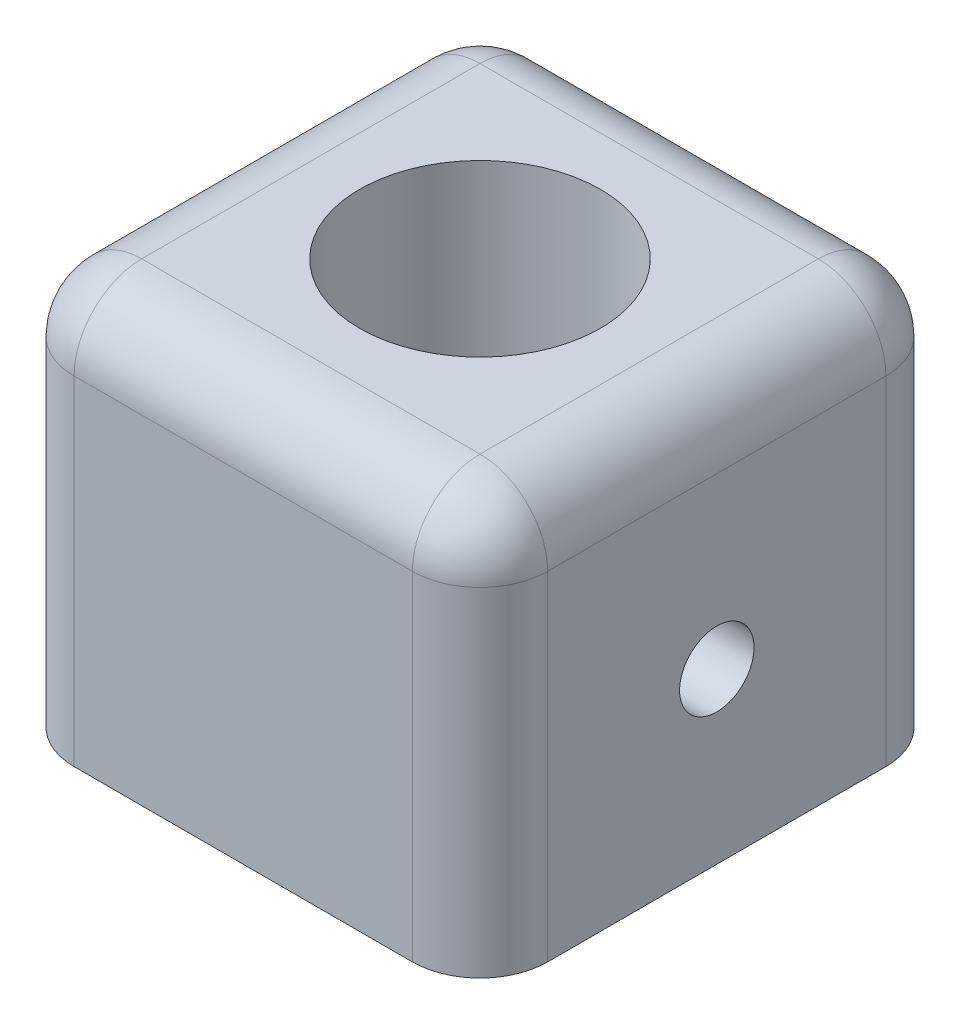
ISO-10303-21;
HEADER;
FILE_DESCRIPTION(('STEP AP214'),'2;1');
FILE_NAME('part.step','',(''),(''),'','','');
FILE_SCHEMA(('AUTOMOTIVE_DESIGN { 1 0 10303 214 1 1 1 1 }'));
ENDSEC;
DATA;
#1=APPLICATION_CONTEXT('core data for automotive mechanical design processes');
#2=APPLICATION_PROTOCOL_DEFINITION('international standard','automotive_design',2000,#1);
#3=PRODUCT_CONTEXT('',#1,'mechanical');
#4=PRODUCT('Part','Part','',(#3));
#5=PRODUCT_RELATED_PRODUCT_CATEGORY('part','',(#4));
#6=PRODUCT_DEFINITION_FORMATION('','',#4);
#7=PRODUCT_DEFINITION_CONTEXT('part definition',#1,'design');
#8=PRODUCT_DEFINITION('design','',#6,#7);
#9=PRODUCT_DEFINITION_SHAPE('','',#8);
#10=(LENGTH_UNIT() NAMED_UNIT(*) SI_UNIT(.MILLI.,.METRE.));
#11=(NAMED_UNIT(*) PLANE_ANGLE_UNIT() SI_UNIT($,.RADIAN.));
#12=(NAMED_UNIT(*) SI_UNIT($,.STERADIAN.) SOLID_ANGLE_UNIT());
#13=UNCERTAINTY_MEASURE_WITH_UNIT(LENGTH_MEASURE(1.E-05),#10,'distance_accuracy_value','');
#14=(GEOMETRIC_REPRESENTATION_CONTEXT(3) GLOBAL_UNCERTAINTY_ASSIGNED_CONTEXT((#13)) GLOBAL_UNIT_ASSIGNED_CONTEXT((#10,
#11,#12)) REPRESENTATION_CONTEXT('',''));
#15=CARTESIAN_POINT('',(0.,0.,0.));
#16=DIRECTION('',(0.,0.,1.));
#17=DIRECTION('',(1.,0.,0.));
#18=AXIS2_PLACEMENT_3D('',#15,#16,#17);
#19=CARTESIAN_POINT('',(0.,30.,0.));
#20=DIRECTION('',(1.,0.,0.));
#21=DIRECTION('',(0.,0.,-1.));
#22=AXIS2_PLACEMENT_3D('',#19,#20,#21);
#23=PLANE('',#22);
#24=DIRECTION('',(0.,0.,1.));
#25=VECTOR('',#24,1.);
#26=CARTESIAN_POINT('',(0.,25.,0.));
#27=LINE('',#26,#25);
#28=CARTESIAN_POINT('',(0.,25.,-5.));
#29=VERTEX_POINT('',#28);
#30=CARTESIAN_POINT('',(0.,25.,-30.));
#31=VERTEX_POINT('',#30);
#32=EDGE_CURVE('E316',#29,#31,#27,.F.);
#33=ORIENTED_EDGE('',*,*,#32,.T.);
#34=DIRECTION('',(0.,-1.,0.));
#35=VECTOR('',#34,1.);
#36=CARTESIAN_POINT('',(0.,30.,-30.));
#37=LINE('',#36,#35);
#38=CARTESIAN_POINT('',(0.,0.,-30.));
#39=VERTEX_POINT('',#38);
#40=EDGE_CURVE('E362',#31,#39,#37,.T.);
#41=ORIENTED_EDGE('',*,*,#40,.T.);
#42=DIRECTION('',(0.,0.,1.));
#43=VECTOR('',#42,1.);
#44=CARTESIAN_POINT('',(0.,0.,0.));
#45=LINE('',#44,#43);
#46=CARTESIAN_POINT('',(0.,0.,-5.));
#47=VERTEX_POINT('',#46);
#48=EDGE_CURVE('E273',#39,#47,#45,.T.);
#49=ORIENTED_EDGE('',*,*,#48,.T.);
#50=DIRECTION('',(0.,-1.,0.));
#51=VECTOR('',#50,1.);
#52=CARTESIAN_POINT('',(0.,30.,-5.));
#53=LINE('',#52,#51);
#54=EDGE_CURVE('E359',#47,#29,#53,.F.);
#55=ORIENTED_EDGE('',*,*,#54,.T.);
#56=EDGE_LOOP('',(#33,#41,#49,#55));
#57=FACE_BOUND('',#56,.T.);
#58=CARTESIAN_POINT('',(0.,12.5,-17.5));
#59=DIRECTION('',(-1.,0.,0.));
#60=DIRECTION('',(0.,0.,1.));
#61=AXIS2_PLACEMENT_3D('',#58,#59,#60);
#62=CIRCLE('',#61,2.75);
#63=CARTESIAN_POINT('',(0.,12.5,-14.75));
#64=VERTEX_POINT('',#63);
#65=EDGE_CURVE('E200',#64,#64,#62,.T.);
#66=ORIENTED_EDGE('',*,*,#65,.F.);
#67=EDGE_LOOP('',(#66));
#68=FACE_BOUND('',#67,.T.);
#69=ADVANCED_FACE('F45',(#57,#68),#23,.F.);
#70=CARTESIAN_POINT('',(35.,30.,0.));
#71=DIRECTION('',(-1.,0.,0.));
#72=DIRECTION('',(0.,0.,1.));
#73=AXIS2_PLACEMENT_3D('',#70,#71,#72);
#74=PLANE('',#73);
#75=DIRECTION('',(0.,0.,-1.));
#76=VECTOR('',#75,1.);
#77=CARTESIAN_POINT('',(35.,0.,0.));
#78=LINE('',#77,#76);
#79=CARTESIAN_POINT('',(35.,0.,-5.));
#80=VERTEX_POINT('',#79);
#81=CARTESIAN_POINT('',(35.,0.,-30.));
#82=VERTEX_POINT('',#81);
#83=EDGE_CURVE('E289',#80,#82,#78,.T.);
#84=ORIENTED_EDGE('',*,*,#83,.T.);
#85=DIRECTION('',(0.,-1.,0.));
#86=VECTOR('',#85,1.);
#87=CARTESIAN_POINT('',(35.,30.,-30.));
#88=LINE('',#87,#86);
#89=CARTESIAN_POINT('',(35.,25.,-30.));
#90=VERTEX_POINT('',#89);
#91=EDGE_CURVE('E385',#82,#90,#88,.F.);
#92=ORIENTED_EDGE('',*,*,#91,.T.);
#93=DIRECTION('',(0.,0.,-1.));
#94=VECTOR('',#93,1.);
#95=CARTESIAN_POINT('',(35.,25.,0.));
#96=LINE('',#95,#94);
#97=CARTESIAN_POINT('',(35.,25.,-5.));
#98=VERTEX_POINT('',#97);
#99=EDGE_CURVE('E324',#90,#98,#96,.F.);
#100=ORIENTED_EDGE('',*,*,#99,.T.);
#101=DIRECTION('',(0.,-1.,0.));
#102=VECTOR('',#101,1.);
#103=CARTESIAN_POINT('',(35.,30.,-5.));
#104=LINE('',#103,#102);
#105=EDGE_CURVE('E382',#98,#80,#104,.T.);
#106=ORIENTED_EDGE('',*,*,#105,.T.);
#107=EDGE_LOOP('',(#84,#92,#100,#106));
#108=FACE_BOUND('',#107,.T.);
#109=CARTESIAN_POINT('',(35.,12.5,-17.5));
#110=DIRECTION('',(1.,0.,0.));
#111=DIRECTION('',(0.,0.,-1.));
#112=AXIS2_PLACEMENT_3D('',#109,#110,#111);
#113=CIRCLE('',#112,2.75);
#114=CARTESIAN_POINT('',(35.,12.5,-20.25));
#115=VERTEX_POINT('',#114);
#116=EDGE_CURVE('E217',#115,#115,#113,.T.);
#117=ORIENTED_EDGE('',*,*,#116,.F.);
#118=EDGE_LOOP('',(#117));
#119=FACE_BOUND('',#118,.T.);
#120=ADVANCED_FACE('F453',(#108,#119),#74,.F.);
#121=CARTESIAN_POINT('',(0.,30.,0.));
#122=DIRECTION('',(0.,0.,-1.));
#123=DIRECTION('',(-1.,0.,0.));
#124=AXIS2_PLACEMENT_3D('',#121,#122,#123);
#125=PLANE('',#124);
#126=DIRECTION('',(1.,0.,0.));
#127=VECTOR('',#126,1.);
#128=CARTESIAN_POINT('',(0.,0.,0.));
#129=LINE('',#128,#127);
#130=CARTESIAN_POINT('',(5.,0.,0.));
#131=VERTEX_POINT('',#130);
#132=CARTESIAN_POINT('',(30.,0.,0.));
#133=VERTEX_POINT('',#132);
#134=EDGE_CURVE('E286',#131,#133,#129,.T.);
#135=ORIENTED_EDGE('',*,*,#134,.T.);
#136=DIRECTION('',(0.,-1.,0.));
#137=VECTOR('',#136,1.);
#138=CARTESIAN_POINT('',(30.,30.,0.));
#139=LINE('',#138,#137);
#140=CARTESIAN_POINT('',(30.,25.,0.));
#141=VERTEX_POINT('',#140);
#142=EDGE_CURVE('E11',#133,#141,#139,.F.);
#143=ORIENTED_EDGE('',*,*,#142,.T.);
#144=DIRECTION('',(1.,0.,0.));
#145=VECTOR('',#144,1.);
#146=CARTESIAN_POINT('',(0.,25.,0.));
#147=LINE('',#146,#145);
#148=CARTESIAN_POINT('',(5.,25.,0.));
#149=VERTEX_POINT('',#148);
#150=EDGE_CURVE('E328',#141,#149,#147,.F.);
#151=ORIENTED_EDGE('',*,*,#150,.T.);
#152=DIRECTION('',(0.,-1.,0.));
#153=VECTOR('',#152,1.);
#154=CARTESIAN_POINT('',(5.,30.,0.));
#155=LINE('',#154,#153);
#156=EDGE_CURVE('E55',#149,#131,#155,.T.);
#157=ORIENTED_EDGE('',*,*,#156,.T.);
#158=EDGE_LOOP('',(#135,#143,#151,#157));
#159=FACE_BOUND('',#158,.T.);
#160=ADVANCED_FACE('F460',(#159),#125,.F.);
#161=CARTESIAN_POINT('',(0.,30.,-35.));
#162=DIRECTION('',(0.,0.,1.));
#163=DIRECTION('',(1.,0.,0.));
#164=AXIS2_PLACEMENT_3D('',#161,#162,#163);
#165=PLANE('',#164);
#166=DIRECTION('',(-1.,0.,0.));
#167=VECTOR('',#166,1.);
#168=CARTESIAN_POINT('',(0.,0.,-35.));
#169=LINE('',#168,#167);
#170=CARTESIAN_POINT('',(30.,0.,-35.));
#171=VERTEX_POINT('',#170);
#172=CARTESIAN_POINT('',(5.,0.,-35.));
#173=VERTEX_POINT('',#172);
#174=EDGE_CURVE('E293',#171,#173,#169,.T.);
#175=ORIENTED_EDGE('',*,*,#174,.T.);
#176=DIRECTION('',(0.,-1.,0.));
#177=VECTOR('',#176,1.);
#178=CARTESIAN_POINT('',(5.,30.,-35.));
#179=LINE('',#178,#177);
#180=CARTESIAN_POINT('',(5.,25.,-35.));
#181=VERTEX_POINT('',#180);
#182=EDGE_CURVE('E379',#173,#181,#179,.F.);
#183=ORIENTED_EDGE('',*,*,#182,.T.);
#184=DIRECTION('',(-1.,0.,0.));
#185=VECTOR('',#184,1.);
#186=CARTESIAN_POINT('',(0.,25.,-35.));
#187=LINE('',#186,#185);
#188=CARTESIAN_POINT('',(30.,25.,-35.));
#189=VERTEX_POINT('',#188);
#190=EDGE_CURVE('E320',#181,#189,#187,.F.);
#191=ORIENTED_EDGE('',*,*,#190,.T.);
#192=DIRECTION('',(0.,-1.,0.));
#193=VECTOR('',#192,1.);
#194=CARTESIAN_POINT('',(30.,30.,-35.));
#195=LINE('',#194,#193);
#196=EDGE_CURVE('E376',#189,#171,#195,.T.);
#197=ORIENTED_EDGE('',*,*,#196,.T.);
#198=EDGE_LOOP('',(#175,#183,#191,#197));
#199=FACE_BOUND('',#198,.T.);
#200=ADVANCED_FACE('F451',(#199),#165,.F.);
#201=CARTESIAN_POINT('',(0.,30.,0.));
#202=DIRECTION('',(0.,-1.,0.));
#203=DIRECTION('',(0.,0.,-1.));
#204=AXIS2_PLACEMENT_3D('',#201,#202,#203);
#205=PLANE('',#204);
#206=DIRECTION('',(-1.,0.,0.));
#207=VECTOR('',#206,1.);
#208=CARTESIAN_POINT('',(0.,30.,-30.));
#209=LINE('',#208,#207);
#210=CARTESIAN_POINT('',(30.,30.,-30.));
#211=VERTEX_POINT('',#210);
#212=CARTESIAN_POINT('',(5.,30.,-30.));
#213=VERTEX_POINT('',#212);
#214=EDGE_CURVE('E308',#211,#213,#209,.T.);
#215=ORIENTED_EDGE('',*,*,#214,.T.);
#216=DIRECTION('',(0.,0.,1.));
#217=VECTOR('',#216,1.);
#218=CARTESIAN_POINT('',(5.,30.,0.));
#219=LINE('',#218,#217);
#220=CARTESIAN_POINT('',(5.,30.,-5.));
#221=VERTEX_POINT('',#220);
#222=EDGE_CURVE('E312',#213,#221,#219,.T.);
#223=ORIENTED_EDGE('',*,*,#222,.T.);
#224=DIRECTION('',(1.,0.,0.));
#225=VECTOR('',#224,1.);
#226=CARTESIAN_POINT('',(0.,30.,-5.));
#227=LINE('',#226,#225);
#228=CARTESIAN_POINT('',(30.,30.,-5.));
#229=VERTEX_POINT('',#228);
#230=EDGE_CURVE('E297',#221,#229,#227,.T.);
#231=ORIENTED_EDGE('',*,*,#230,.T.);
#232=DIRECTION('',(0.,0.,-1.));
#233=VECTOR('',#232,1.);
#234=CARTESIAN_POINT('',(30.,30.,0.));
#235=LINE('',#234,#233);
#236=EDGE_CURVE('E304',#229,#211,#235,.T.);
#237=ORIENTED_EDGE('',*,*,#236,.T.);
#238=EDGE_LOOP('',(#215,#223,#231,#237));
#239=FACE_BOUND('',#238,.T.);
#240=CARTESIAN_POINT('',(17.5,30.,-17.5));
#241=DIRECTION('',(0.,1.,0.));
#242=DIRECTION('',(0.,0.,1.));
#243=AXIS2_PLACEMENT_3D('',#240,#241,#242);
#244=CIRCLE('',#243,8.9);
#245=CARTESIAN_POINT('',(17.5,30.,-8.6));
#246=VERTEX_POINT('',#245);
#247=EDGE_CURVE('E233',#246,#246,#244,.T.);
#248=ORIENTED_EDGE('',*,*,#247,.F.);
#249=EDGE_LOOP('',(#248));
#250=FACE_BOUND('',#249,.T.);
#251=ADVANCED_FACE('F433',(#239,#250),#205,.F.);
#252=CARTESIAN_POINT('',(0.,0.,0.));
#253=DIRECTION('',(0.,-1.,0.));
#254=DIRECTION('',(0.,0.,-1.));
#255=AXIS2_PLACEMENT_3D('',#252,#253,#254);
#256=PLANE('',#255);
#257=CARTESIAN_POINT('',(17.5,0.,-31.25));
#258=DIRECTION('',(0.,-1.,0.));
#259=DIRECTION('',(0.,0.,-1.));
#260=AXIS2_PLACEMENT_3D('',#257,#258,#259);
#261=CIRCLE('',#260,1.25);
#262=CARTESIAN_POINT('',(17.5,0.,-32.5));
#263=VERTEX_POINT('',#262);
#264=EDGE_CURVE('E171',#263,#263,#261,.T.);
#265=ORIENTED_EDGE('',*,*,#264,.F.);
#266=EDGE_LOOP('',(#265));
#267=FACE_BOUND('',#266,.T.);
#268=CARTESIAN_POINT('',(3.75,0.,-17.5));
#269=DIRECTION('',(0.,-1.,0.));
#270=DIRECTION('',(0.,0.,-1.));
#271=AXIS2_PLACEMENT_3D('',#268,#269,#270);
#272=CIRCLE('',#271,1.25);
#273=CARTESIAN_POINT('',(3.75,0.,-18.75));
#274=VERTEX_POINT('',#273);
#275=EDGE_CURVE('E170',#274,#274,#272,.T.);
#276=ORIENTED_EDGE('',*,*,#275,.F.);
#277=EDGE_LOOP('',(#276));
#278=FACE_BOUND('',#277,.T.);
#279=CARTESIAN_POINT('',(17.5,0.,-3.75));
#280=DIRECTION('',(0.,-1.,0.));
#281=DIRECTION('',(0.,0.,-1.));
#282=AXIS2_PLACEMENT_3D('',#279,#280,#281);
#283=CIRCLE('',#282,1.25);
#284=CARTESIAN_POINT('',(17.5,0.,-5.));
#285=VERTEX_POINT('',#284);
#286=EDGE_CURVE('E184',#285,#285,#283,.T.);
#287=ORIENTED_EDGE('',*,*,#286,.F.);
#288=EDGE_LOOP('',(#287));
#289=FACE_BOUND('',#288,.T.);
#290=CARTESIAN_POINT('',(31.25,0.,-17.5));
#291=DIRECTION('',(0.,-1.,0.));
#292=DIRECTION('',(0.,0.,-1.));
#293=AXIS2_PLACEMENT_3D('',#290,#291,#292);
#294=CIRCLE('',#293,1.25);
#295=CARTESIAN_POINT('',(31.25,0.,-18.75));
#296=VERTEX_POINT('',#295);
#297=EDGE_CURVE('E192',#296,#296,#294,.T.);
#298=ORIENTED_EDGE('',*,*,#297,.F.);
#299=EDGE_LOOP('',(#298));
#300=FACE_BOUND('',#299,.T.);
#301=DIRECTION('',(0.,0.,1.));
#302=VECTOR('',#301,1.);
#303=CARTESIAN_POINT('',(27.5,0.,-27.5));
#304=LINE('',#303,#302);
#305=CARTESIAN_POINT('',(27.5,0.,-27.5));
#306=VERTEX_POINT('',#305);
#307=CARTESIAN_POINT('',(27.5,0.,-7.5));
#308=VERTEX_POINT('',#307);
#309=EDGE_CURVE('E256',#306,#308,#304,.T.);
#310=ORIENTED_EDGE('',*,*,#309,.F.);
#311=DIRECTION('',(1.,0.,0.));
#312=VECTOR('',#311,1.);
#313=CARTESIAN_POINT('',(7.5,0.,-27.5));
#314=LINE('',#313,#312);
#315=CARTESIAN_POINT('',(7.5,0.,-27.5));
#316=VERTEX_POINT('',#315);
#317=EDGE_CURVE('E243',#316,#306,#314,.T.);
#318=ORIENTED_EDGE('',*,*,#317,.F.);
#319=DIRECTION('',(0.,0.,-1.));
#320=VECTOR('',#319,1.);
#321=CARTESIAN_POINT('',(7.5,0.,-27.5));
#322=LINE('',#321,#320);
#323=CARTESIAN_POINT('',(7.5,0.,-7.5));
#324=VERTEX_POINT('',#323);
#325=EDGE_CURVE('E263',#324,#316,#322,.T.);
#326=ORIENTED_EDGE('',*,*,#325,.F.);
#327=DIRECTION('',(-1.,0.,0.));
#328=VECTOR('',#327,1.);
#329=CARTESIAN_POINT('',(7.5,0.,-7.5));
#330=LINE('',#329,#328);
#331=EDGE_CURVE('E259',#308,#324,#330,.T.);
#332=ORIENTED_EDGE('',*,*,#331,.F.);
#333=EDGE_LOOP('',(#310,#318,#326,#332));
#334=FACE_BOUND('',#333,.T.);
#335=ORIENTED_EDGE('',*,*,#48,.F.);
#336=CARTESIAN_POINT('',(5.,0.,-30.));
#337=DIRECTION('',(0.,-1.,0.));
#338=DIRECTION('',(0.,0.,-1.));
#339=AXIS2_PLACEMENT_3D('',#336,#337,#338);
#340=CIRCLE('',#339,5.);
#341=EDGE_CURVE('E373',#39,#173,#340,.T.);
#342=ORIENTED_EDGE('',*,*,#341,.T.);
#343=ORIENTED_EDGE('',*,*,#174,.F.);
#344=CARTESIAN_POINT('',(30.,0.,-30.));
#345=DIRECTION('',(0.,-1.,0.));
#346=DIRECTION('',(0.,0.,-1.));
#347=AXIS2_PLACEMENT_3D('',#344,#345,#346);
#348=CIRCLE('',#347,5.);
#349=EDGE_CURVE('E370',#171,#82,#348,.T.);
#350=ORIENTED_EDGE('',*,*,#349,.T.);
#351=ORIENTED_EDGE('',*,*,#83,.F.);
#352=CARTESIAN_POINT('',(30.,0.,-5.));
#353=DIRECTION('',(0.,-1.,0.));
#354=DIRECTION('',(0.,0.,-1.));
#355=AXIS2_PLACEMENT_3D('',#352,#353,#354);
#356=CIRCLE('',#355,5.);
#357=EDGE_CURVE('E63',#80,#133,#356,.T.);
#358=ORIENTED_EDGE('',*,*,#357,.T.);
#359=ORIENTED_EDGE('',*,*,#134,.F.);
#360=CARTESIAN_POINT('',(5.,0.,-5.));
#361=DIRECTION('',(0.,-1.,0.));
#362=DIRECTION('',(0.,0.,-1.));
#363=AXIS2_PLACEMENT_3D('',#360,#361,#362);
#364=CIRCLE('',#363,5.);
#365=EDGE_CURVE('E365',#131,#47,#364,.T.);
#366=ORIENTED_EDGE('',*,*,#365,.T.);
#367=EDGE_LOOP('',(#335,#342,#343,#350,#351,#358,#359,#366));
#368=FACE_BOUND('',#367,.T.);
#369=ADVANCED_FACE('F410',(#267,#278,#289,#300,#334,#368),#256,.T.);
#370=CARTESIAN_POINT('',(27.5,15.,-27.5));
#371=DIRECTION('',(1.,0.,0.));
#372=DIRECTION('',(0.,0.,-1.));
#373=AXIS2_PLACEMENT_3D('',#370,#371,#372);
#374=PLANE('',#373);
#375=CARTESIAN_POINT('',(27.5,12.5,-17.5));
#376=DIRECTION('',(1.,0.,0.));
#377=DIRECTION('',(0.,0.,-1.));
#378=AXIS2_PLACEMENT_3D('',#375,#376,#377);
#379=CIRCLE('',#378,1.3);
#380=CARTESIAN_POINT('',(27.5,12.5,-18.8));
#381=VERTEX_POINT('',#380);
#382=EDGE_CURVE('E229',#381,#381,#379,.T.);
#383=ORIENTED_EDGE('',*,*,#382,.T.);
#384=EDGE_LOOP('',(#383));
#385=FACE_BOUND('',#384,.T.);
#386=ORIENTED_EDGE('',*,*,#309,.T.);
#387=DIRECTION('',(0.,-1.,0.));
#388=VECTOR('',#387,1.);
#389=CARTESIAN_POINT('',(27.5,15.,-7.5));
#390=LINE('',#389,#388);
#391=CARTESIAN_POINT('',(27.5,15.,-7.5));
#392=VERTEX_POINT('',#391);
#393=EDGE_CURVE('E255',#392,#308,#390,.T.);
#394=ORIENTED_EDGE('',*,*,#393,.F.);
#395=DIRECTION('',(0.,0.,1.));
#396=VECTOR('',#395,1.);
#397=CARTESIAN_POINT('',(27.5,15.,-27.5));
#398=LINE('',#397,#396);
#399=CARTESIAN_POINT('',(27.5,15.,-27.5));
#400=VERTEX_POINT('',#399);
#401=EDGE_CURVE('E238',#400,#392,#398,.T.);
#402=ORIENTED_EDGE('',*,*,#401,.F.);
#403=DIRECTION('',(0.,-1.,0.));
#404=VECTOR('',#403,1.);
#405=CARTESIAN_POINT('',(27.5,15.,-27.5));
#406=LINE('',#405,#404);
#407=EDGE_CURVE('E270',#400,#306,#406,.T.);
#408=ORIENTED_EDGE('',*,*,#407,.T.);
#409=EDGE_LOOP('',(#386,#394,#402,#408));
#410=FACE_BOUND('',#409,.T.);
#411=ADVANCED_FACE('F539',(#385,#410),#374,.F.);
#412=CARTESIAN_POINT('',(7.5,15.,-27.5));
#413=DIRECTION('',(0.,0.,-1.));
#414=DIRECTION('',(-1.,0.,0.));
#415=AXIS2_PLACEMENT_3D('',#412,#413,#414);
#416=PLANE('',#415);
#417=ORIENTED_EDGE('',*,*,#317,.T.);
#418=ORIENTED_EDGE('',*,*,#407,.F.);
#419=DIRECTION('',(1.,0.,0.));
#420=VECTOR('',#419,1.);
#421=CARTESIAN_POINT('',(7.5,15.,-27.5));
#422=LINE('',#421,#420);
#423=CARTESIAN_POINT('',(7.5,15.,-27.5));
#424=VERTEX_POINT('',#423);
#425=EDGE_CURVE('E251',#424,#400,#422,.T.);
#426=ORIENTED_EDGE('',*,*,#425,.F.);
#427=DIRECTION('',(0.,-1.,0.));
#428=VECTOR('',#427,1.);
#429=CARTESIAN_POINT('',(7.5,15.,-27.5));
#430=LINE('',#429,#428);
#431=EDGE_CURVE('E274',#424,#316,#430,.T.);
#432=ORIENTED_EDGE('',*,*,#431,.T.);
#433=EDGE_LOOP('',(#417,#418,#426,#432));
#434=FACE_BOUND('',#433,.T.);
#435=ADVANCED_FACE('F638',(#434),#416,.F.);
#436=CARTESIAN_POINT('',(7.5,15.,-27.5));
#437=DIRECTION('',(-1.,0.,0.));
#438=DIRECTION('',(0.,0.,1.));
#439=AXIS2_PLACEMENT_3D('',#436,#437,#438);
#440=PLANE('',#439);
#441=CARTESIAN_POINT('',(7.5,12.5,-17.5));
#442=DIRECTION('',(-1.,0.,0.));
#443=DIRECTION('',(0.,0.,1.));
#444=AXIS2_PLACEMENT_3D('',#441,#442,#443);
#445=CIRCLE('',#444,1.3);
#446=CARTESIAN_POINT('',(7.5,12.5,-16.2));
#447=VERTEX_POINT('',#446);
#448=EDGE_CURVE('E213',#447,#447,#445,.T.);
#449=ORIENTED_EDGE('',*,*,#448,.T.);
#450=EDGE_LOOP('',(#449));
#451=FACE_BOUND('',#450,.T.);
#452=ORIENTED_EDGE('',*,*,#325,.T.);
#453=ORIENTED_EDGE('',*,*,#431,.F.);
#454=DIRECTION('',(0.,0.,-1.));
#455=VECTOR('',#454,1.);
#456=CARTESIAN_POINT('',(7.5,15.,-27.5));
#457=LINE('',#456,#455);
#458=CARTESIAN_POINT('',(7.5,15.,-7.5));
#459=VERTEX_POINT('',#458);
#460=EDGE_CURVE('E247',#459,#424,#457,.T.);
#461=ORIENTED_EDGE('',*,*,#460,.F.);
#462=DIRECTION('',(0.,-1.,0.));
#463=VECTOR('',#462,1.);
#464=CARTESIAN_POINT('',(7.5,15.,-7.5));
#465=LINE('',#464,#463);
#466=EDGE_CURVE('E277',#459,#324,#465,.T.);
#467=ORIENTED_EDGE('',*,*,#466,.T.);
#468=EDGE_LOOP('',(#452,#453,#461,#467));
#469=FACE_BOUND('',#468,.T.);
#470=ADVANCED_FACE('F648',(#451,#469),#440,.F.);
#471=CARTESIAN_POINT('',(7.5,15.,-7.5));
#472=DIRECTION('',(0.,0.,1.));
#473=DIRECTION('',(1.,0.,0.));
#474=AXIS2_PLACEMENT_3D('',#471,#472,#473);
#475=PLANE('',#474);
#476=ORIENTED_EDGE('',*,*,#331,.T.);
#477=ORIENTED_EDGE('',*,*,#466,.F.);
#478=DIRECTION('',(-1.,0.,0.));
#479=VECTOR('',#478,1.);
#480=CARTESIAN_POINT('',(7.5,15.,-7.5));
#481=LINE('',#480,#479);
#482=EDGE_CURVE('E242',#392,#459,#481,.T.);
#483=ORIENTED_EDGE('',*,*,#482,.F.);
#484=ORIENTED_EDGE('',*,*,#393,.T.);
#485=EDGE_LOOP('',(#476,#477,#483,#484));
#486=FACE_BOUND('',#485,.T.);
#487=ADVANCED_FACE('F657',(#486),#475,.F.);
#488=CARTESIAN_POINT('',(0.,15.,0.));
#489=DIRECTION('',(0.,1.,0.));
#490=DIRECTION('',(0.,0.,1.));
#491=AXIS2_PLACEMENT_3D('',#488,#489,#490);
#492=PLANE('',#491);
#493=CARTESIAN_POINT('',(17.5,15.,-17.5));
#494=DIRECTION('',(0.,1.,0.));
#495=DIRECTION('',(0.,0.,1.));
#496=AXIS2_PLACEMENT_3D('',#493,#494,#495);
#497=CIRCLE('',#496,8.9);
#498=CARTESIAN_POINT('',(17.5,15.,-8.6));
#499=VERTEX_POINT('',#498);
#500=EDGE_CURVE('E237',#499,#499,#497,.T.);
#501=ORIENTED_EDGE('',*,*,#500,.T.);
#502=EDGE_LOOP('',(#501));
#503=FACE_BOUND('',#502,.T.);
#504=ORIENTED_EDGE('',*,*,#401,.T.);
#505=ORIENTED_EDGE('',*,*,#482,.T.);
#506=ORIENTED_EDGE('',*,*,#460,.T.);
#507=ORIENTED_EDGE('',*,*,#425,.T.);
#508=EDGE_LOOP('',(#504,#505,#506,#507));
#509=FACE_BOUND('',#508,.T.);
#510=ADVANCED_FACE('F666',(#503,#509),#492,.F.);
#511=CARTESIAN_POINT('',(17.5,0.,-17.5));
#512=DIRECTION('',(0.,1.,0.));
#513=DIRECTION('',(0.,0.,1.));
#514=AXIS2_PLACEMENT_3D('',#511,#512,#513);
#515=CYLINDRICAL_SURFACE('',#514,8.9);
#516=ORIENTED_EDGE('',*,*,#247,.T.);
#517=EDGE_LOOP('',(#516));
#518=FACE_BOUND('',#517,.T.);
#519=ORIENTED_EDGE('',*,*,#500,.F.);
#520=EDGE_LOOP('',(#519));
#521=FACE_BOUND('',#520,.T.);
#522=ADVANCED_FACE('F674',(#518,#521),#515,.F.);
#523=CARTESIAN_POINT('',(35.,12.5,-17.5));
#524=DIRECTION('',(1.,0.,0.));
#525=DIRECTION('',(0.,0.,-1.));
#526=AXIS2_PLACEMENT_3D('',#523,#524,#525);
#527=CYLINDRICAL_SURFACE('',#526,1.3);
#528=ORIENTED_EDGE('',*,*,#382,.F.);
#529=EDGE_LOOP('',(#528));
#530=FACE_BOUND('',#529,.T.);
#531=CARTESIAN_POINT('',(29.,12.5,-17.5));
#532=DIRECTION('',(1.,0.,0.));
#533=DIRECTION('',(0.,0.,-1.));
#534=AXIS2_PLACEMENT_3D('',#531,#532,#533);
#535=CIRCLE('',#534,1.3);
#536=CARTESIAN_POINT('',(29.,12.5,-18.8));
#537=VERTEX_POINT('',#536);
#538=EDGE_CURVE('E225',#537,#537,#535,.T.);
#539=ORIENTED_EDGE('',*,*,#538,.T.);
#540=EDGE_LOOP('',(#539));
#541=FACE_BOUND('',#540,.T.);
#542=ADVANCED_FACE('F681',(#530,#541),#527,.F.);
#543=CARTESIAN_POINT('',(29.,13.8,-17.5));
#544=DIRECTION('',(-1.,0.,0.));
#545=DIRECTION('',(0.,0.,1.));
#546=AXIS2_PLACEMENT_3D('',#543,#544,#545);
#547=PLANE('',#546);
#548=ORIENTED_EDGE('',*,*,#538,.F.);
#549=EDGE_LOOP('',(#548));
#550=FACE_BOUND('',#549,.T.);
#551=CARTESIAN_POINT('',(29.,12.5,-17.5));
#552=DIRECTION('',(1.,0.,0.));
#553=DIRECTION('',(0.,0.,-1.));
#554=AXIS2_PLACEMENT_3D('',#551,#552,#553);
#555=CIRCLE('',#554,2.75);
#556=CARTESIAN_POINT('',(29.,12.5,-20.25));
#557=VERTEX_POINT('',#556);
#558=EDGE_CURVE('E221',#557,#557,#555,.T.);
#559=ORIENTED_EDGE('',*,*,#558,.T.);
#560=EDGE_LOOP('',(#559));
#561=FACE_BOUND('',#560,.T.);
#562=ADVANCED_FACE('F688',(#550,#561),#547,.F.);
#563=CARTESIAN_POINT('',(35.,12.5,-17.5));
#564=DIRECTION('',(1.,0.,0.));
#565=DIRECTION('',(0.,0.,-1.));
#566=AXIS2_PLACEMENT_3D('',#563,#564,#565);
#567=CYLINDRICAL_SURFACE('',#566,2.75);
#568=ORIENTED_EDGE('',*,*,#558,.F.);
#569=EDGE_LOOP('',(#568));
#570=FACE_BOUND('',#569,.T.);
#571=ORIENTED_EDGE('',*,*,#116,.T.);
#572=EDGE_LOOP('',(#571));
#573=FACE_BOUND('',#572,.T.);
#574=ADVANCED_FACE('F696',(#570,#573),#567,.F.);
#575=CARTESIAN_POINT('',(0.,12.5,-17.5));
#576=DIRECTION('',(-1.,0.,0.));
#577=DIRECTION('',(0.,0.,1.));
#578=AXIS2_PLACEMENT_3D('',#575,#576,#577);
#579=CYLINDRICAL_SURFACE('',#578,1.3);
#580=ORIENTED_EDGE('',*,*,#448,.F.);
#581=EDGE_LOOP('',(#580));
#582=FACE_BOUND('',#581,.T.);
#583=CARTESIAN_POINT('',(6.,12.5,-17.5));
#584=DIRECTION('',(-1.,0.,0.));
#585=DIRECTION('',(0.,0.,1.));
#586=AXIS2_PLACEMENT_3D('',#583,#584,#585);
#587=CIRCLE('',#586,1.30000000000001);
#588=CARTESIAN_POINT('',(6.,12.5,-16.2));
#589=VERTEX_POINT('',#588);
#590=EDGE_CURVE('E209',#589,#589,#587,.T.);
#591=ORIENTED_EDGE('',*,*,#590,.T.);
#592=EDGE_LOOP('',(#591));
#593=FACE_BOUND('',#592,.T.);
#594=ADVANCED_FACE('F703',(#582,#593),#579,.F.);
#595=CARTESIAN_POINT('',(6.,13.8,-17.5));
#596=DIRECTION('',(1.,0.,0.));
#597=DIRECTION('',(0.,0.,-1.));
#598=AXIS2_PLACEMENT_3D('',#595,#596,#597);
#599=PLANE('',#598);
#600=ORIENTED_EDGE('',*,*,#590,.F.);
#601=EDGE_LOOP('',(#600));
#602=FACE_BOUND('',#601,.T.);
#603=CARTESIAN_POINT('',(6.,12.5,-17.5));
#604=DIRECTION('',(-1.,0.,0.));
#605=DIRECTION('',(0.,0.,1.));
#606=AXIS2_PLACEMENT_3D('',#603,#604,#605);
#607=CIRCLE('',#606,2.75);
#608=CARTESIAN_POINT('',(6.,12.5,-14.75));
#609=VERTEX_POINT('',#608);
#610=EDGE_CURVE('E204',#609,#609,#607,.T.);
#611=ORIENTED_EDGE('',*,*,#610,.T.);
#612=EDGE_LOOP('',(#611));
#613=FACE_BOUND('',#612,.T.);
#614=ADVANCED_FACE('F710',(#602,#613),#599,.F.);
#615=CARTESIAN_POINT('',(0.,12.5,-17.5));
#616=DIRECTION('',(-1.,0.,0.));
#617=DIRECTION('',(0.,0.,1.));
#618=AXIS2_PLACEMENT_3D('',#615,#616,#617);
#619=CYLINDRICAL_SURFACE('',#618,2.75);
#620=ORIENTED_EDGE('',*,*,#610,.F.);
#621=EDGE_LOOP('',(#620));
#622=FACE_BOUND('',#621,.T.);
#623=ORIENTED_EDGE('',*,*,#65,.T.);
#624=EDGE_LOOP('',(#623));
#625=FACE_BOUND('',#624,.T.);
#626=ADVANCED_FACE('F488',(#622,#625),#619,.F.);
#627=CARTESIAN_POINT('',(30.,25.,0.));
#628=DIRECTION('',(0.,0.,-1.));
#629=DIRECTION('',(-1.,0.,0.));
#630=AXIS2_PLACEMENT_3D('',#627,#628,#629);
#631=CYLINDRICAL_SURFACE('',#630,5.);
#632=ORIENTED_EDGE('',*,*,#99,.F.);
#633=CARTESIAN_POINT('',(30.,25.,-30.));
#634=DIRECTION('',(0.,0.,-1.));
#635=DIRECTION('',(-1.,0.,0.));
#636=AXIS2_PLACEMENT_3D('',#633,#634,#635);
#637=CIRCLE('',#636,5.);
#638=EDGE_CURVE('E349',#90,#211,#637,.F.);
#639=ORIENTED_EDGE('',*,*,#638,.T.);
#640=ORIENTED_EDGE('',*,*,#236,.F.);
#641=CARTESIAN_POINT('',(30.,25.,-5.));
#642=DIRECTION('',(0.,0.,-1.));
#643=DIRECTION('',(-1.,0.,0.));
#644=AXIS2_PLACEMENT_3D('',#641,#642,#643);
#645=CIRCLE('',#644,5.);
#646=EDGE_CURVE('E346',#229,#98,#645,.T.);
#647=ORIENTED_EDGE('',*,*,#646,.T.);
#648=EDGE_LOOP('',(#632,#639,#640,#647));
#649=FACE_BOUND('',#648,.T.);
#650=ADVANCED_FACE('F439',(#649),#631,.T.);
#651=CARTESIAN_POINT('',(0.,25.,-30.));
#652=DIRECTION('',(-1.,0.,0.));
#653=DIRECTION('',(0.,0.,1.));
#654=AXIS2_PLACEMENT_3D('',#651,#652,#653);
#655=CYLINDRICAL_SURFACE('',#654,5.);
#656=ORIENTED_EDGE('',*,*,#190,.F.);
#657=CARTESIAN_POINT('',(5.,25.,-30.));
#658=DIRECTION('',(-1.,0.,0.));
#659=DIRECTION('',(0.,0.,1.));
#660=AXIS2_PLACEMENT_3D('',#657,#658,#659);
#661=CIRCLE('',#660,5.);
#662=EDGE_CURVE('E343',#181,#213,#661,.F.);
#663=ORIENTED_EDGE('',*,*,#662,.T.);
#664=ORIENTED_EDGE('',*,*,#214,.F.);
#665=CARTESIAN_POINT('',(30.,25.,-30.));
#666=DIRECTION('',(-1.,0.,0.));
#667=DIRECTION('',(0.,0.,1.));
#668=AXIS2_PLACEMENT_3D('',#665,#666,#667);
#669=CIRCLE('',#668,5.);
#670=EDGE_CURVE('E339',#211,#189,#669,.T.);
#671=ORIENTED_EDGE('',*,*,#670,.T.);
#672=EDGE_LOOP('',(#656,#663,#664,#671));
#673=FACE_BOUND('',#672,.T.);
#674=ADVANCED_FACE('F430',(#673),#655,.T.);
#675=CARTESIAN_POINT('',(0.,25.,-5.));
#676=DIRECTION('',(1.,0.,0.));
#677=DIRECTION('',(0.,0.,-1.));
#678=AXIS2_PLACEMENT_3D('',#675,#676,#677);
#679=CYLINDRICAL_SURFACE('',#678,5.);
#680=ORIENTED_EDGE('',*,*,#150,.F.);
#681=CARTESIAN_POINT('',(30.,25.,-5.));
#682=DIRECTION('',(1.,0.,0.));
#683=DIRECTION('',(0.,0.,-1.));
#684=AXIS2_PLACEMENT_3D('',#681,#682,#683);
#685=CIRCLE('',#684,5.);
#686=EDGE_CURVE('E355',#141,#229,#685,.F.);
#687=ORIENTED_EDGE('',*,*,#686,.T.);
#688=ORIENTED_EDGE('',*,*,#230,.F.);
#689=CARTESIAN_POINT('',(5.,25.,-5.));
#690=DIRECTION('',(1.,0.,0.));
#691=DIRECTION('',(0.,0.,-1.));
#692=AXIS2_PLACEMENT_3D('',#689,#690,#691);
#693=CIRCLE('',#692,5.);
#694=EDGE_CURVE('E352',#221,#149,#693,.T.);
#695=ORIENTED_EDGE('',*,*,#694,.T.);
#696=EDGE_LOOP('',(#680,#687,#688,#695));
#697=FACE_BOUND('',#696,.T.);
#698=ADVANCED_FACE('F462',(#697),#679,.T.);
#699=CARTESIAN_POINT('',(5.,25.,0.));
#700=DIRECTION('',(0.,0.,1.));
#701=DIRECTION('',(1.,0.,0.));
#702=AXIS2_PLACEMENT_3D('',#699,#700,#701);
#703=CYLINDRICAL_SURFACE('',#702,5.);
#704=ORIENTED_EDGE('',*,*,#222,.F.);
#705=CARTESIAN_POINT('',(5.,25.,-30.));
#706=DIRECTION('',(0.,0.,1.));
#707=DIRECTION('',(1.,0.,0.));
#708=AXIS2_PLACEMENT_3D('',#705,#706,#707);
#709=CIRCLE('',#708,5.);
#710=EDGE_CURVE('E335',#213,#31,#709,.T.);
#711=ORIENTED_EDGE('',*,*,#710,.T.);
#712=ORIENTED_EDGE('',*,*,#32,.F.);
#713=CARTESIAN_POINT('',(5.,25.,-5.));
#714=DIRECTION('',(0.,0.,1.));
#715=DIRECTION('',(1.,0.,0.));
#716=AXIS2_PLACEMENT_3D('',#713,#714,#715);
#717=CIRCLE('',#716,5.);
#718=EDGE_CURVE('E331',#29,#221,#717,.F.);
#719=ORIENTED_EDGE('',*,*,#718,.T.);
#720=EDGE_LOOP('',(#704,#711,#712,#719));
#721=FACE_BOUND('',#720,.T.);
#722=ADVANCED_FACE('F423',(#721),#703,.T.);
#723=CARTESIAN_POINT('',(5.,30.,-30.));
#724=DIRECTION('',(0.,-1.,0.));
#725=DIRECTION('',(0.,0.,-1.));
#726=AXIS2_PLACEMENT_3D('',#723,#724,#725);
#727=CYLINDRICAL_SURFACE('',#726,5.);
#728=ORIENTED_EDGE('',*,*,#341,.F.);
#729=ORIENTED_EDGE('',*,*,#40,.F.);
#730=CARTESIAN_POINT('',(5.,25.,-30.));
#731=DIRECTION('',(0.,1.,0.));
#732=DIRECTION('',(0.,0.,1.));
#733=AXIS2_PLACEMENT_3D('',#730,#731,#732);
#734=CIRCLE('',#733,5.);
#735=EDGE_CURVE('E205',#181,#31,#734,.T.);
#736=ORIENTED_EDGE('',*,*,#735,.F.);
#737=ORIENTED_EDGE('',*,*,#182,.F.);
#738=EDGE_LOOP('',(#728,#729,#736,#737));
#739=FACE_BOUND('',#738,.T.);
#740=ADVANCED_FACE('F418',(#739),#727,.T.);
#741=CARTESIAN_POINT('',(5.,25.,-30.));
#742=DIRECTION('',(0.,0.,1.));
#743=DIRECTION('',(1.,0.,0.));
#744=AXIS2_PLACEMENT_3D('',#741,#742,#743);
#745=SPHERICAL_SURFACE('',#744,5.);
#746=ORIENTED_EDGE('',*,*,#710,.F.);
#747=ORIENTED_EDGE('',*,*,#662,.F.);
#748=ORIENTED_EDGE('',*,*,#735,.T.);
#749=EDGE_LOOP('',(#746,#747,#748));
#750=FACE_BOUND('',#749,.T.);
#751=ADVANCED_FACE('F426',(#750),#745,.T.);
#752=CARTESIAN_POINT('',(30.,30.,-30.));
#753=DIRECTION('',(0.,-1.,0.));
#754=DIRECTION('',(0.,0.,-1.));
#755=AXIS2_PLACEMENT_3D('',#752,#753,#754);
#756=CYLINDRICAL_SURFACE('',#755,5.);
#757=ORIENTED_EDGE('',*,*,#349,.F.);
#758=ORIENTED_EDGE('',*,*,#196,.F.);
#759=CARTESIAN_POINT('',(30.,25.,-30.));
#760=DIRECTION('',(0.,1.,0.));
#761=DIRECTION('',(0.,0.,1.));
#762=AXIS2_PLACEMENT_3D('',#759,#760,#761);
#763=CIRCLE('',#762,5.);
#764=EDGE_CURVE('E392',#90,#189,#763,.T.);
#765=ORIENTED_EDGE('',*,*,#764,.F.);
#766=ORIENTED_EDGE('',*,*,#91,.F.);
#767=EDGE_LOOP('',(#757,#758,#765,#766));
#768=FACE_BOUND('',#767,.T.);
#769=ADVANCED_FACE('F448',(#768),#756,.T.);
#770=CARTESIAN_POINT('',(30.,25.,-30.));
#771=DIRECTION('',(0.,0.,1.));
#772=DIRECTION('',(1.,0.,0.));
#773=AXIS2_PLACEMENT_3D('',#770,#771,#772);
#774=SPHERICAL_SURFACE('',#773,5.);
#775=ORIENTED_EDGE('',*,*,#670,.F.);
#776=ORIENTED_EDGE('',*,*,#638,.F.);
#777=ORIENTED_EDGE('',*,*,#764,.T.);
#778=EDGE_LOOP('',(#775,#776,#777));
#779=FACE_BOUND('',#778,.T.);
#780=ADVANCED_FACE('F443',(#779),#774,.T.);
#781=CARTESIAN_POINT('',(30.,30.,-5.));
#782=DIRECTION('',(0.,-1.,0.));
#783=DIRECTION('',(0.,0.,-1.));
#784=AXIS2_PLACEMENT_3D('',#781,#782,#783);
#785=CYLINDRICAL_SURFACE('',#784,5.);
#786=ORIENTED_EDGE('',*,*,#357,.F.);
#787=ORIENTED_EDGE('',*,*,#105,.F.);
#788=CARTESIAN_POINT('',(30.,25.,-5.));
#789=DIRECTION('',(0.,1.,0.));
#790=DIRECTION('',(0.,0.,1.));
#791=AXIS2_PLACEMENT_3D('',#788,#789,#790);
#792=CIRCLE('',#791,5.);
#793=EDGE_CURVE('E394',#141,#98,#792,.T.);
#794=ORIENTED_EDGE('',*,*,#793,.F.);
#795=ORIENTED_EDGE('',*,*,#142,.F.);
#796=EDGE_LOOP('',(#786,#787,#794,#795));
#797=FACE_BOUND('',#796,.T.);
#798=ADVANCED_FACE('F457',(#797),#785,.T.);
#799=CARTESIAN_POINT('',(30.,25.,-5.));
#800=DIRECTION('',(0.,0.,1.));
#801=DIRECTION('',(1.,0.,0.));
#802=AXIS2_PLACEMENT_3D('',#799,#800,#801);
#803=SPHERICAL_SURFACE('',#802,5.);
#804=ORIENTED_EDGE('',*,*,#793,.T.);
#805=ORIENTED_EDGE('',*,*,#646,.F.);
#806=ORIENTED_EDGE('',*,*,#686,.F.);
#807=EDGE_LOOP('',(#804,#805,#806));
#808=FACE_BOUND('',#807,.T.);
#809=ADVANCED_FACE('F463',(#808),#803,.T.);
#810=CARTESIAN_POINT('',(5.,30.,-5.));
#811=DIRECTION('',(0.,-1.,0.));
#812=DIRECTION('',(0.,0.,-1.));
#813=AXIS2_PLACEMENT_3D('',#810,#811,#812);
#814=CYLINDRICAL_SURFACE('',#813,5.);
#815=ORIENTED_EDGE('',*,*,#365,.F.);
#816=ORIENTED_EDGE('',*,*,#156,.F.);
#817=CARTESIAN_POINT('',(5.,25.,-5.));
#818=DIRECTION('',(0.,1.,0.));
#819=DIRECTION('',(0.,0.,1.));
#820=AXIS2_PLACEMENT_3D('',#817,#818,#819);
#821=CIRCLE('',#820,5.);
#822=EDGE_CURVE('E49',#29,#149,#821,.T.);
#823=ORIENTED_EDGE('',*,*,#822,.F.);
#824=ORIENTED_EDGE('',*,*,#54,.F.);
#825=EDGE_LOOP('',(#815,#816,#823,#824));
#826=FACE_BOUND('',#825,.T.);
#827=ADVANCED_FACE('F47',(#826),#814,.T.);
#828=CARTESIAN_POINT('',(5.,25.,-5.));
#829=DIRECTION('',(0.,0.,1.));
#830=DIRECTION('',(1.,0.,0.));
#831=AXIS2_PLACEMENT_3D('',#828,#829,#830);
#832=SPHERICAL_SURFACE('',#831,5.);
#833=ORIENTED_EDGE('',*,*,#822,.T.);
#834=ORIENTED_EDGE('',*,*,#694,.F.);
#835=ORIENTED_EDGE('',*,*,#718,.F.);
#836=EDGE_LOOP('',(#833,#834,#835));
#837=FACE_BOUND('',#836,.T.);
#838=ADVANCED_FACE('F405',(#837),#832,.T.);
#839=CARTESIAN_POINT('',(31.25,5.,-17.5));
#840=DIRECTION('',(0.,-1.,0.));
#841=DIRECTION('',(0.,0.,-1.));
#842=AXIS2_PLACEMENT_3D('',#839,#840,#841);
#843=CONICAL_SURFACE('',#842,1.25,1.02974425867665);
#844=CARTESIAN_POINT('',(31.25,5.75107577378445,-17.5));
#845=VERTEX_POINT('',#844);
#846=VERTEX_LOOP('',#845);
#847=FACE_BOUND('',#846,.T.);
#848=CARTESIAN_POINT('',(31.25,5.,-17.5));
#849=DIRECTION('',(0.,-1.,0.));
#850=DIRECTION('',(0.,0.,-1.));
#851=AXIS2_PLACEMENT_3D('',#848,#849,#850);
#852=CIRCLE('',#851,1.25);
#853=CARTESIAN_POINT('',(31.25,5.,-18.75));
#854=VERTEX_POINT('',#853);
#855=EDGE_CURVE('E196',#854,#854,#852,.T.);
#856=ORIENTED_EDGE('',*,*,#855,.T.);
#857=EDGE_LOOP('',(#856));
#858=FACE_BOUND('',#857,.T.);
#859=ADVANCED_FACE('F527',(#847,#858),#843,.F.);
#860=CARTESIAN_POINT('',(31.25,0.,-17.5));
#861=DIRECTION('',(0.,-1.,0.));
#862=DIRECTION('',(0.,0.,-1.));
#863=AXIS2_PLACEMENT_3D('',#860,#861,#862);
#864=CYLINDRICAL_SURFACE('',#863,1.25);
#865=ORIENTED_EDGE('',*,*,#855,.F.);
#866=EDGE_LOOP('',(#865));
#867=FACE_BOUND('',#866,.T.);
#868=ORIENTED_EDGE('',*,*,#297,.T.);
#869=EDGE_LOOP('',(#868));
#870=FACE_BOUND('',#869,.T.);
#871=ADVANCED_FACE('F550',(#867,#870),#864,.F.);
#872=CARTESIAN_POINT('',(17.5,5.,-3.75));
#873=DIRECTION('',(0.,-1.,0.));
#874=DIRECTION('',(0.,0.,-1.));
#875=AXIS2_PLACEMENT_3D('',#872,#873,#874);
#876=CONICAL_SURFACE('',#875,1.25,1.02974425867665);
#877=CARTESIAN_POINT('',(17.5,5.75107577378445,-3.75));
#878=VERTEX_POINT('',#877);
#879=VERTEX_LOOP('',#878);
#880=FACE_BOUND('',#879,.T.);
#881=CARTESIAN_POINT('',(17.5,5.,-3.75));
#882=DIRECTION('',(0.,-1.,0.));
#883=DIRECTION('',(0.,0.,-1.));
#884=AXIS2_PLACEMENT_3D('',#881,#882,#883);
#885=CIRCLE('',#884,1.25);
#886=CARTESIAN_POINT('',(17.5,5.,-5.));
#887=VERTEX_POINT('',#886);
#888=EDGE_CURVE('E188',#887,#887,#885,.T.);
#889=ORIENTED_EDGE('',*,*,#888,.T.);
#890=EDGE_LOOP('',(#889));
#891=FACE_BOUND('',#890,.T.);
#892=ADVANCED_FACE('F561',(#880,#891),#876,.F.);
#893=CARTESIAN_POINT('',(17.5,0.,-3.75));
#894=DIRECTION('',(0.,-1.,0.));
#895=DIRECTION('',(0.,0.,-1.));
#896=AXIS2_PLACEMENT_3D('',#893,#894,#895);
#897=CYLINDRICAL_SURFACE('',#896,1.25);
#898=ORIENTED_EDGE('',*,*,#888,.F.);
#899=EDGE_LOOP('',(#898));
#900=FACE_BOUND('',#899,.T.);
#901=ORIENTED_EDGE('',*,*,#286,.T.);
#902=EDGE_LOOP('',(#901));
#903=FACE_BOUND('',#902,.T.);
#904=ADVANCED_FACE('F572',(#900,#903),#897,.F.);
#905=CARTESIAN_POINT('',(3.75,5.,-17.5));
#906=DIRECTION('',(0.,-1.,0.));
#907=DIRECTION('',(0.,0.,-1.));
#908=AXIS2_PLACEMENT_3D('',#905,#906,#907);
#909=CONICAL_SURFACE('',#908,1.25,1.02974425867665);
#910=CARTESIAN_POINT('',(3.75,5.75107577378445,-17.5));
#911=VERTEX_POINT('',#910);
#912=VERTEX_LOOP('',#911);
#913=FACE_BOUND('',#912,.T.);
#914=CARTESIAN_POINT('',(3.75,5.,-17.5));
#915=DIRECTION('',(0.,-1.,0.));
#916=DIRECTION('',(0.,0.,-1.));
#917=AXIS2_PLACEMENT_3D('',#914,#915,#916);
#918=CIRCLE('',#917,1.25);
#919=CARTESIAN_POINT('',(3.75,5.,-18.75));
#920=VERTEX_POINT('',#919);
#921=EDGE_CURVE('E176',#920,#920,#918,.T.);
#922=ORIENTED_EDGE('',*,*,#921,.T.);
#923=EDGE_LOOP('',(#922));
#924=FACE_BOUND('',#923,.T.);
#925=ADVANCED_FACE('F582',(#913,#924),#909,.F.);
#926=CARTESIAN_POINT('',(3.75,0.,-17.5));
#927=DIRECTION('',(0.,-1.,0.));
#928=DIRECTION('',(0.,0.,-1.));
#929=AXIS2_PLACEMENT_3D('',#926,#927,#928);
#930=CYLINDRICAL_SURFACE('',#929,1.25);
#931=ORIENTED_EDGE('',*,*,#921,.F.);
#932=EDGE_LOOP('',(#931));
#933=FACE_BOUND('',#932,.T.);
#934=ORIENTED_EDGE('',*,*,#275,.T.);
#935=EDGE_LOOP('',(#934));
#936=FACE_BOUND('',#935,.T.);
#937=ADVANCED_FACE('F163',(#933,#936),#930,.F.);
#938=CARTESIAN_POINT('',(17.5,5.,-31.25));
#939=DIRECTION('',(0.,-1.,0.));
#940=DIRECTION('',(0.,0.,-1.));
#941=AXIS2_PLACEMENT_3D('',#938,#939,#940);
#942=CONICAL_SURFACE('',#941,1.25,1.02974425867665);
#943=CARTESIAN_POINT('',(17.5,5.75107577378445,-31.25));
#944=VERTEX_POINT('',#943);
#945=VERTEX_LOOP('',#944);
#946=FACE_BOUND('',#945,.T.);
#947=CARTESIAN_POINT('',(17.5,5.,-31.25));
#948=DIRECTION('',(0.,-1.,0.));
#949=DIRECTION('',(0.,0.,-1.));
#950=AXIS2_PLACEMENT_3D('',#947,#948,#949);
#951=CIRCLE('',#950,1.25);
#952=CARTESIAN_POINT('',(17.5,5.,-32.5));
#953=VERTEX_POINT('',#952);
#954=EDGE_CURVE('E167',#953,#953,#951,.T.);
#955=ORIENTED_EDGE('',*,*,#954,.T.);
#956=EDGE_LOOP('',(#955));
#957=FACE_BOUND('',#956,.T.);
#958=ADVANCED_FACE('F159',(#946,#957),#942,.F.);
#959=CARTESIAN_POINT('',(17.5,0.,-31.25));
#960=DIRECTION('',(0.,-1.,0.));
#961=DIRECTION('',(0.,0.,-1.));
#962=AXIS2_PLACEMENT_3D('',#959,#960,#961);
#963=CYLINDRICAL_SURFACE('',#962,1.25);
#964=ORIENTED_EDGE('',*,*,#954,.F.);
#965=EDGE_LOOP('',(#964));
#966=FACE_BOUND('',#965,.T.);
#967=ORIENTED_EDGE('',*,*,#264,.T.);
#968=EDGE_LOOP('',(#967));
#969=FACE_BOUND('',#968,.T.);
#970=ADVANCED_FACE('F162',(#966,#969),#963,.F.);
#971=CLOSED_SHELL('',(#69,#120,#160,#200,#251,#369,#411,#435,#470,#487,#510,#522,#542,#562,#574,
#594,#614,#626,#650,#674,#698,#722,#740,#751,#769,#780,#798,#809,#827,#838,#859,#871,#892,#904,
#925,#937,#958,#970));
#972=MANIFOLD_SOLID_BREP('B2',#971);
#973=ADVANCED_BREP_SHAPE_REPRESENTATION('',(#18,#972),#14);
#974=SHAPE_DEFINITION_REPRESENTATION(#9,#973);
ENDSEC;
END-ISO-10303-21;
